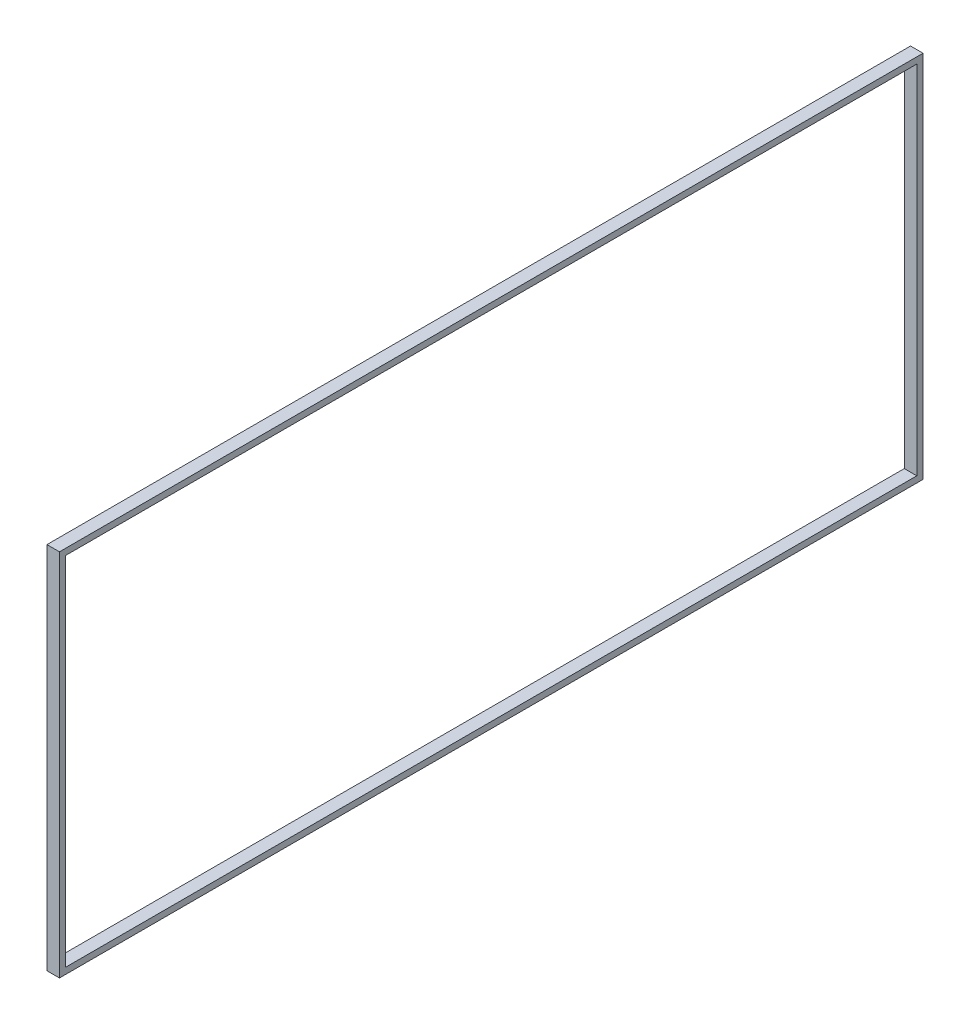
ISO-10303-21;
HEADER;
FILE_DESCRIPTION(('STEP AP214'),'2;1');
FILE_NAME('part.step','',(''),(''),'','','');
FILE_SCHEMA(('AUTOMOTIVE_DESIGN { 1 0 10303 214 1 1 1 1 }'));
ENDSEC;
DATA;
#1=APPLICATION_CONTEXT('core data for automotive mechanical design processes');
#2=APPLICATION_PROTOCOL_DEFINITION('international standard','automotive_design',2000,#1);
#3=PRODUCT_CONTEXT('',#1,'mechanical');
#4=PRODUCT('Part','Part','',(#3));
#5=PRODUCT_RELATED_PRODUCT_CATEGORY('part','',(#4));
#6=PRODUCT_DEFINITION_FORMATION('','',#4);
#7=PRODUCT_DEFINITION_CONTEXT('part definition',#1,'design');
#8=PRODUCT_DEFINITION('design','',#6,#7);
#9=PRODUCT_DEFINITION_SHAPE('','',#8);
#10=(LENGTH_UNIT() NAMED_UNIT(*) SI_UNIT(.MILLI.,.METRE.));
#11=(NAMED_UNIT(*) PLANE_ANGLE_UNIT() SI_UNIT($,.RADIAN.));
#12=(NAMED_UNIT(*) SI_UNIT($,.STERADIAN.) SOLID_ANGLE_UNIT());
#13=UNCERTAINTY_MEASURE_WITH_UNIT(LENGTH_MEASURE(1.E-05),#10,'distance_accuracy_value','');
#14=(GEOMETRIC_REPRESENTATION_CONTEXT(3) GLOBAL_UNCERTAINTY_ASSIGNED_CONTEXT((#13)) GLOBAL_UNIT_ASSIGNED_CONTEXT((#10,
#11,#12)) REPRESENTATION_CONTEXT('',''));
#15=CARTESIAN_POINT('',(0.,0.,0.));
#16=DIRECTION('',(0.,0.,1.));
#17=DIRECTION('',(1.,0.,0.));
#18=AXIS2_PLACEMENT_3D('',#15,#16,#17);
#19=CARTESIAN_POINT('',(1377.78,1978.71953,3585.20199));
#20=DIRECTION('',(0.,0.,1.));
#21=DIRECTION('',(1.,0.,0.));
#22=AXIS2_PLACEMENT_3D('',#19,#20,#21);
#23=PLANE('',#22);
#24=DIRECTION('',(0.,-1.,0.));
#25=VECTOR('',#24,1.);
#26=CARTESIAN_POINT('',(1477.78,1978.71953,3585.20199));
#27=LINE('',#26,#25);
#28=CARTESIAN_POINT('',(1477.78,1978.71953,3585.20199));
#29=VERTEX_POINT('',#28);
#30=CARTESIAN_POINT('',(1477.78,-972.653091228266,3585.20199));
#31=VERTEX_POINT('',#30);
#32=EDGE_CURVE('E131',#29,#31,#27,.T.);
#33=ORIENTED_EDGE('',*,*,#32,.F.);
#34=DIRECTION('',(1.,0.,0.));
#35=VECTOR('',#34,1.);
#36=CARTESIAN_POINT('',(1377.78,1978.71953,3585.20199));
#37=LINE('',#36,#35);
#38=CARTESIAN_POINT('',(1377.78,1978.71953,3585.20199));
#39=VERTEX_POINT('',#38);
#40=EDGE_CURVE('E11',#39,#29,#37,.T.);
#41=ORIENTED_EDGE('',*,*,#40,.F.);
#42=DIRECTION('',(0.,-1.,0.));
#43=VECTOR('',#42,1.);
#44=CARTESIAN_POINT('',(1377.78,1978.71953,3585.20199));
#45=LINE('',#44,#43);
#46=CARTESIAN_POINT('',(1377.78,-972.653091228266,3585.20199));
#47=VERTEX_POINT('',#46);
#48=EDGE_CURVE('E135',#39,#47,#45,.T.);
#49=ORIENTED_EDGE('',*,*,#48,.T.);
#50=DIRECTION('',(1.,0.,0.));
#51=VECTOR('',#50,1.);
#52=CARTESIAN_POINT('',(1377.78,-972.653091228266,3585.20199));
#53=LINE('',#52,#51);
#54=EDGE_CURVE('E36',#47,#31,#53,.T.);
#55=ORIENTED_EDGE('',*,*,#54,.T.);
#56=EDGE_LOOP('',(#33,#41,#49,#55));
#57=FACE_BOUND('',#56,.T.);
#58=ADVANCED_FACE('F33',(#57),#23,.T.);
#59=CARTESIAN_POINT('',(1377.78,1978.71953,3585.20199));
#60=DIRECTION('',(0.,1.,0.));
#61=DIRECTION('',(0.,0.,1.));
#62=AXIS2_PLACEMENT_3D('',#59,#60,#61);
#63=PLANE('',#62);
#64=DIRECTION('',(0.,0.,1.));
#65=VECTOR('',#64,1.);
#66=CARTESIAN_POINT('',(1477.78,1978.71953,3585.20199));
#67=LINE('',#66,#65);
#68=CARTESIAN_POINT('',(1477.78,1978.71953,-3320.2));
#69=VERTEX_POINT('',#68);
#70=EDGE_CURVE('E139',#69,#29,#67,.T.);
#71=ORIENTED_EDGE('',*,*,#70,.F.);
#72=DIRECTION('',(1.,0.,0.));
#73=VECTOR('',#72,1.);
#74=CARTESIAN_POINT('',(1377.78,1978.71953,-3320.2));
#75=LINE('',#74,#73);
#76=CARTESIAN_POINT('',(1377.78,1978.71953,-3320.2));
#77=VERTEX_POINT('',#76);
#78=EDGE_CURVE('E41',#77,#69,#75,.T.);
#79=ORIENTED_EDGE('',*,*,#78,.F.);
#80=DIRECTION('',(0.,0.,1.));
#81=VECTOR('',#80,1.);
#82=CARTESIAN_POINT('',(1377.78,1978.71953,3585.20199));
#83=LINE('',#82,#81);
#84=EDGE_CURVE('E145',#77,#39,#83,.T.);
#85=ORIENTED_EDGE('',*,*,#84,.T.);
#86=ORIENTED_EDGE('',*,*,#40,.T.);
#87=EDGE_LOOP('',(#71,#79,#85,#86));
#88=FACE_BOUND('',#87,.T.);
#89=ADVANCED_FACE('F171',(#88),#63,.T.);
#90=CARTESIAN_POINT('',(1377.78,1978.71953,-3320.2));
#91=DIRECTION('',(0.,0.,-1.));
#92=DIRECTION('',(0.,1.,0.));
#93=AXIS2_PLACEMENT_3D('',#90,#91,#92);
#94=PLANE('',#93);
#95=DIRECTION('',(0.,1.,0.));
#96=VECTOR('',#95,1.);
#97=CARTESIAN_POINT('',(1477.78,1978.71953,-3320.2));
#98=LINE('',#97,#96);
#99=CARTESIAN_POINT('',(1477.78,-972.653091228267,-3320.2));
#100=VERTEX_POINT('',#99);
#101=EDGE_CURVE('E153',#100,#69,#98,.T.);
#102=ORIENTED_EDGE('',*,*,#101,.F.);
#103=DIRECTION('',(1.,0.,0.));
#104=VECTOR('',#103,1.);
#105=CARTESIAN_POINT('',(1377.78,-972.653091228267,-3320.2));
#106=LINE('',#105,#104);
#107=CARTESIAN_POINT('',(1377.78,-972.653091228267,-3320.2));
#108=VERTEX_POINT('',#107);
#109=EDGE_CURVE('E158',#108,#100,#106,.T.);
#110=ORIENTED_EDGE('',*,*,#109,.F.);
#111=DIRECTION('',(0.,1.,0.));
#112=VECTOR('',#111,1.);
#113=CARTESIAN_POINT('',(1377.78,1978.71953,-3320.2));
#114=LINE('',#113,#112);
#115=EDGE_CURVE('E142',#108,#77,#114,.T.);
#116=ORIENTED_EDGE('',*,*,#115,.T.);
#117=ORIENTED_EDGE('',*,*,#78,.T.);
#118=EDGE_LOOP('',(#102,#110,#116,#117));
#119=FACE_BOUND('',#118,.T.);
#120=ADVANCED_FACE('F175',(#119),#94,.T.);
#121=CARTESIAN_POINT('',(1377.78,-972.653091228266,3585.20199));
#122=DIRECTION('',(0.,-1.,0.));
#123=DIRECTION('',(0.,0.,-1.));
#124=AXIS2_PLACEMENT_3D('',#121,#122,#123);
#125=PLANE('',#124);
#126=DIRECTION('',(0.,0.,-1.));
#127=VECTOR('',#126,1.);
#128=CARTESIAN_POINT('',(1477.78,-972.653091228266,3585.20199));
#129=LINE('',#128,#127);
#130=EDGE_CURVE('E150',#31,#100,#129,.T.);
#131=ORIENTED_EDGE('',*,*,#130,.F.);
#132=ORIENTED_EDGE('',*,*,#54,.F.);
#133=DIRECTION('',(0.,0.,-1.));
#134=VECTOR('',#133,1.);
#135=CARTESIAN_POINT('',(1377.78,-972.653091228266,3585.20199));
#136=LINE('',#135,#134);
#137=EDGE_CURVE('E138',#47,#108,#136,.T.);
#138=ORIENTED_EDGE('',*,*,#137,.T.);
#139=ORIENTED_EDGE('',*,*,#109,.T.);
#140=EDGE_LOOP('',(#131,#132,#138,#139));
#141=FACE_BOUND('',#140,.T.);
#142=ADVANCED_FACE('F166',(#141),#125,.T.);
#143=CARTESIAN_POINT('',(1377.78,0.,0.));
#144=DIRECTION('',(1.,0.,0.));
#145=DIRECTION('',(0.,0.,-1.));
#146=AXIS2_PLACEMENT_3D('',#143,#144,#145);
#147=PLANE('',#146);
#148=DIRECTION('',(0.,0.,1.));
#149=VECTOR('',#148,1.);
#150=CARTESIAN_POINT('',(1377.78,1928.71953,3535.20199));
#151=LINE('',#150,#149);
#152=CARTESIAN_POINT('',(1377.78,1928.71953,-3270.2));
#153=VERTEX_POINT('',#152);
#154=CARTESIAN_POINT('',(1377.78,1928.71953,3535.20199));
#155=VERTEX_POINT('',#154);
#156=EDGE_CURVE('E106',#153,#155,#151,.T.);
#157=ORIENTED_EDGE('',*,*,#156,.T.);
#158=DIRECTION('',(0.,-1.,0.));
#159=VECTOR('',#158,1.);
#160=CARTESIAN_POINT('',(1377.78,1928.71953,3535.20199));
#161=LINE('',#160,#159);
#162=CARTESIAN_POINT('',(1377.78,-922.653091228266,3535.20199));
#163=VERTEX_POINT('',#162);
#164=EDGE_CURVE('E100',#155,#163,#161,.T.);
#165=ORIENTED_EDGE('',*,*,#164,.T.);
#166=DIRECTION('',(0.,0.,-1.));
#167=VECTOR('',#166,1.);
#168=CARTESIAN_POINT('',(1377.78,-922.653091228266,3535.20199));
#169=LINE('',#168,#167);
#170=CARTESIAN_POINT('',(1377.78,-922.653091228267,-3270.2));
#171=VERTEX_POINT('',#170);
#172=EDGE_CURVE('E109',#163,#171,#169,.T.);
#173=ORIENTED_EDGE('',*,*,#172,.T.);
#174=DIRECTION('',(0.,1.,0.));
#175=VECTOR('',#174,1.);
#176=CARTESIAN_POINT('',(1377.78,1928.71953,-3270.2));
#177=LINE('',#176,#175);
#178=EDGE_CURVE('E49',#171,#153,#177,.T.);
#179=ORIENTED_EDGE('',*,*,#178,.T.);
#180=EDGE_LOOP('',(#157,#165,#173,#179));
#181=FACE_BOUND('',#180,.T.);
#182=ORIENTED_EDGE('',*,*,#48,.F.);
#183=ORIENTED_EDGE('',*,*,#84,.F.);
#184=ORIENTED_EDGE('',*,*,#115,.F.);
#185=ORIENTED_EDGE('',*,*,#137,.F.);
#186=EDGE_LOOP('',(#182,#183,#184,#185));
#187=FACE_BOUND('',#186,.T.);
#188=ADVANCED_FACE('F113',(#181,#187),#147,.F.);
#189=CARTESIAN_POINT('',(1477.78,0.,0.));
#190=DIRECTION('',(1.,0.,0.));
#191=DIRECTION('',(0.,0.,-1.));
#192=AXIS2_PLACEMENT_3D('',#189,#190,#191);
#193=PLANE('',#192);
#194=DIRECTION('',(0.,-1.,0.));
#195=VECTOR('',#194,1.);
#196=CARTESIAN_POINT('',(1477.78,1928.71953,3535.20199));
#197=LINE('',#196,#195);
#198=CARTESIAN_POINT('',(1477.78,1928.71953,3535.20199));
#199=VERTEX_POINT('',#198);
#200=CARTESIAN_POINT('',(1477.78,-922.653091228266,3535.20199));
#201=VERTEX_POINT('',#200);
#202=EDGE_CURVE('E57',#199,#201,#197,.T.);
#203=ORIENTED_EDGE('',*,*,#202,.F.);
#204=DIRECTION('',(0.,0.,1.));
#205=VECTOR('',#204,1.);
#206=CARTESIAN_POINT('',(1477.78,1928.71953,3535.20199));
#207=LINE('',#206,#205);
#208=CARTESIAN_POINT('',(1477.78,1928.71953,-3270.2));
#209=VERTEX_POINT('',#208);
#210=EDGE_CURVE('E116',#209,#199,#207,.T.);
#211=ORIENTED_EDGE('',*,*,#210,.F.);
#212=DIRECTION('',(0.,1.,0.));
#213=VECTOR('',#212,1.);
#214=CARTESIAN_POINT('',(1477.78,1928.71953,-3270.2));
#215=LINE('',#214,#213);
#216=CARTESIAN_POINT('',(1477.78,-922.653091228267,-3270.2));
#217=VERTEX_POINT('',#216);
#218=EDGE_CURVE('E119',#217,#209,#215,.T.);
#219=ORIENTED_EDGE('',*,*,#218,.F.);
#220=DIRECTION('',(0.,0.,-1.));
#221=VECTOR('',#220,1.);
#222=CARTESIAN_POINT('',(1477.78,-922.653091228266,3535.20199));
#223=LINE('',#222,#221);
#224=EDGE_CURVE('E125',#201,#217,#223,.T.);
#225=ORIENTED_EDGE('',*,*,#224,.F.);
#226=EDGE_LOOP('',(#203,#211,#219,#225));
#227=FACE_BOUND('',#226,.T.);
#228=ORIENTED_EDGE('',*,*,#32,.T.);
#229=ORIENTED_EDGE('',*,*,#130,.T.);
#230=ORIENTED_EDGE('',*,*,#101,.T.);
#231=ORIENTED_EDGE('',*,*,#70,.T.);
#232=EDGE_LOOP('',(#228,#229,#230,#231));
#233=FACE_BOUND('',#232,.T.);
#234=ADVANCED_FACE('F168',(#227,#233),#193,.T.);
#235=CARTESIAN_POINT('',(1377.78,1928.71953,3535.20199));
#236=DIRECTION('',(0.,0.,1.));
#237=DIRECTION('',(0.,-1.,0.));
#238=AXIS2_PLACEMENT_3D('',#235,#236,#237);
#239=PLANE('',#238);
#240=ORIENTED_EDGE('',*,*,#202,.T.);
#241=DIRECTION('',(1.,0.,0.));
#242=VECTOR('',#241,1.);
#243=CARTESIAN_POINT('',(1377.78,-922.653091228266,3535.20199));
#244=LINE('',#243,#242);
#245=EDGE_CURVE('E96',#163,#201,#244,.T.);
#246=ORIENTED_EDGE('',*,*,#245,.F.);
#247=ORIENTED_EDGE('',*,*,#164,.F.);
#248=DIRECTION('',(1.,0.,0.));
#249=VECTOR('',#248,1.);
#250=CARTESIAN_POINT('',(1377.78,1928.71953,3535.20199));
#251=LINE('',#250,#249);
#252=EDGE_CURVE('E129',#155,#199,#251,.T.);
#253=ORIENTED_EDGE('',*,*,#252,.T.);
#254=EDGE_LOOP('',(#240,#246,#247,#253));
#255=FACE_BOUND('',#254,.T.);
#256=ADVANCED_FACE('F98',(#255),#239,.F.);
#257=CARTESIAN_POINT('',(1377.78,1928.71953,3535.20199));
#258=DIRECTION('',(0.,1.,0.));
#259=DIRECTION('',(0.,0.,1.));
#260=AXIS2_PLACEMENT_3D('',#257,#258,#259);
#261=PLANE('',#260);
#262=ORIENTED_EDGE('',*,*,#210,.T.);
#263=ORIENTED_EDGE('',*,*,#252,.F.);
#264=ORIENTED_EDGE('',*,*,#156,.F.);
#265=DIRECTION('',(1.,0.,0.));
#266=VECTOR('',#265,1.);
#267=CARTESIAN_POINT('',(1377.78,1928.71953,-3270.2));
#268=LINE('',#267,#266);
#269=EDGE_CURVE('E132',#153,#209,#268,.T.);
#270=ORIENTED_EDGE('',*,*,#269,.T.);
#271=EDGE_LOOP('',(#262,#263,#264,#270));
#272=FACE_BOUND('',#271,.T.);
#273=ADVANCED_FACE('F226',(#272),#261,.F.);
#274=CARTESIAN_POINT('',(1377.78,1928.71953,-3270.2));
#275=DIRECTION('',(0.,0.,-1.));
#276=DIRECTION('',(0.,1.,0.));
#277=AXIS2_PLACEMENT_3D('',#274,#275,#276);
#278=PLANE('',#277);
#279=ORIENTED_EDGE('',*,*,#218,.T.);
#280=ORIENTED_EDGE('',*,*,#269,.F.);
#281=ORIENTED_EDGE('',*,*,#178,.F.);
#282=DIRECTION('',(1.,0.,0.));
#283=VECTOR('',#282,1.);
#284=CARTESIAN_POINT('',(1377.78,-922.653091228267,-3270.2));
#285=LINE('',#284,#283);
#286=EDGE_CURVE('E105',#171,#217,#285,.T.);
#287=ORIENTED_EDGE('',*,*,#286,.T.);
#288=EDGE_LOOP('',(#279,#280,#281,#287));
#289=FACE_BOUND('',#288,.T.);
#290=ADVANCED_FACE('F235',(#289),#278,.F.);
#291=CARTESIAN_POINT('',(1377.78,-922.653091228266,3535.20199));
#292=DIRECTION('',(0.,-1.,0.));
#293=DIRECTION('',(0.,0.,-1.));
#294=AXIS2_PLACEMENT_3D('',#291,#292,#293);
#295=PLANE('',#294);
#296=ORIENTED_EDGE('',*,*,#224,.T.);
#297=ORIENTED_EDGE('',*,*,#286,.F.);
#298=ORIENTED_EDGE('',*,*,#172,.F.);
#299=ORIENTED_EDGE('',*,*,#245,.T.);
#300=EDGE_LOOP('',(#296,#297,#298,#299));
#301=FACE_BOUND('',#300,.T.);
#302=ADVANCED_FACE('F110',(#301),#295,.F.);
#303=CLOSED_SHELL('',(#58,#89,#120,#142,#188,#234,#256,#273,#290,#302));
#304=MANIFOLD_SOLID_BREP('B2',#303);
#305=ADVANCED_BREP_SHAPE_REPRESENTATION('',(#18,#304),#14);
#306=SHAPE_DEFINITION_REPRESENTATION(#9,#305);
ENDSEC;
END-ISO-10303-21;
